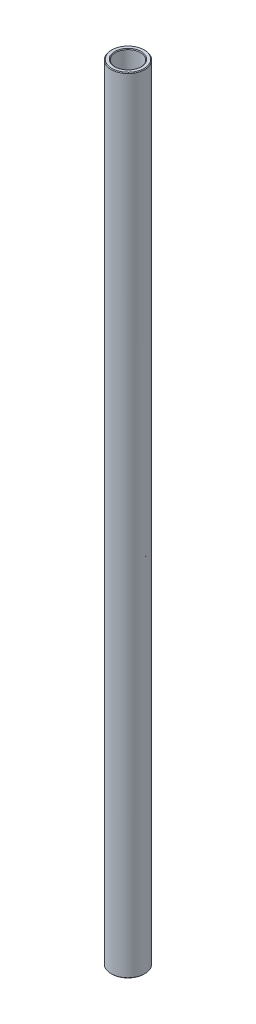
ISO-10303-21;
HEADER;
FILE_DESCRIPTION(('STEP AP214'),'2;1');
FILE_NAME('part.step','',(''),(''),'','','');
FILE_SCHEMA(('AUTOMOTIVE_DESIGN { 1 0 10303 214 1 1 1 1 }'));
ENDSEC;
DATA;
#1=APPLICATION_CONTEXT('core data for automotive mechanical design processes');
#2=APPLICATION_PROTOCOL_DEFINITION('international standard','automotive_design',2000,#1);
#3=PRODUCT_CONTEXT('',#1,'mechanical');
#4=PRODUCT('Part','Part','',(#3));
#5=PRODUCT_RELATED_PRODUCT_CATEGORY('part','',(#4));
#6=PRODUCT_DEFINITION_FORMATION('','',#4);
#7=PRODUCT_DEFINITION_CONTEXT('part definition',#1,'design');
#8=PRODUCT_DEFINITION('design','',#6,#7);
#9=PRODUCT_DEFINITION_SHAPE('','',#8);
#10=(LENGTH_UNIT() NAMED_UNIT(*) SI_UNIT(.MILLI.,.METRE.));
#11=(NAMED_UNIT(*) PLANE_ANGLE_UNIT() SI_UNIT($,.RADIAN.));
#12=(NAMED_UNIT(*) SI_UNIT($,.STERADIAN.) SOLID_ANGLE_UNIT());
#13=UNCERTAINTY_MEASURE_WITH_UNIT(LENGTH_MEASURE(1.E-05),#10,'distance_accuracy_value','');
#14=(GEOMETRIC_REPRESENTATION_CONTEXT(3) GLOBAL_UNCERTAINTY_ASSIGNED_CONTEXT((#13)) GLOBAL_UNIT_ASSIGNED_CONTEXT((#10,
#11,#12)) REPRESENTATION_CONTEXT('',''));
#15=CARTESIAN_POINT('',(0.,0.,0.));
#16=DIRECTION('',(0.,0.,1.));
#17=DIRECTION('',(1.,0.,0.));
#18=AXIS2_PLACEMENT_3D('',#15,#16,#17);
#19=CARTESIAN_POINT('',(0.,11.60859375,0.));
#20=DIRECTION('',(0.,1.,0.));
#21=DIRECTION('',(-1.,0.,0.));
#22=AXIS2_PLACEMENT_3D('',#19,#20,#21);
#23=CYLINDRICAL_SURFACE('',#22,4.7625);
#24=CARTESIAN_POINT('',(0.,-148.336,0.));
#25=DIRECTION('',(0.,1.,0.));
#26=DIRECTION('',(-1.,0.,0.));
#27=AXIS2_PLACEMENT_3D('',#24,#25,#26);
#28=CIRCLE('',#27,4.7625);
#29=CARTESIAN_POINT('',(-4.76250000000002,-148.336,0.));
#30=VERTEX_POINT('',#29);
#31=EDGE_CURVE('E57',#30,#30,#28,.F.);
#32=ORIENTED_EDGE('',*,*,#31,.T.);
#33=EDGE_LOOP('',(#32));
#34=FACE_BOUND('',#33,.T.);
#35=CARTESIAN_POINT('',(0.,148.336,0.));
#36=DIRECTION('',(0.,-1.,0.));
#37=DIRECTION('',(1.,0.,0.));
#38=AXIS2_PLACEMENT_3D('',#35,#36,#37);
#39=CIRCLE('',#38,4.7625);
#40=CARTESIAN_POINT('',(4.76250000000002,148.336,0.));
#41=VERTEX_POINT('',#40);
#42=EDGE_CURVE('E60',#41,#41,#39,.F.);
#43=ORIENTED_EDGE('',*,*,#42,.T.);
#44=EDGE_LOOP('',(#43));
#45=FACE_BOUND('',#44,.T.);
#46=ADVANCED_FACE('F37',(#34,#45),#23,.F.);
#47=CARTESIAN_POINT('',(4.76249999999998,148.59,0.));
#48=DIRECTION('',(0.,-1.,0.));
#49=DIRECTION('',(1.,0.,0.));
#50=AXIS2_PLACEMENT_3D('',#47,#48,#49);
#51=PLANE('',#50);
#52=CARTESIAN_POINT('',(0.,148.59,0.));
#53=DIRECTION('',(0.,-1.,0.));
#54=DIRECTION('',(1.,0.,0.));
#55=AXIS2_PLACEMENT_3D('',#52,#53,#54);
#56=CIRCLE('',#55,6.09599999999996);
#57=CARTESIAN_POINT('',(6.09599999999998,148.59,0.));
#58=VERTEX_POINT('',#57);
#59=EDGE_CURVE('E10',#58,#58,#56,.F.);
#60=ORIENTED_EDGE('',*,*,#59,.T.);
#61=EDGE_LOOP('',(#60));
#62=FACE_BOUND('',#61,.T.);
#63=CARTESIAN_POINT('',(0.,148.59,0.));
#64=DIRECTION('',(0.,-1.,0.));
#65=DIRECTION('',(1.,0.,0.));
#66=AXIS2_PLACEMENT_3D('',#63,#64,#65);
#67=CIRCLE('',#66,5.01650000000001);
#68=CARTESIAN_POINT('',(5.01650000000003,148.59,0.));
#69=VERTEX_POINT('',#68);
#70=EDGE_CURVE('E44',#69,#69,#67,.T.);
#71=ORIENTED_EDGE('',*,*,#70,.T.);
#72=EDGE_LOOP('',(#71));
#73=FACE_BOUND('',#72,.T.);
#74=ADVANCED_FACE('F83',(#62,#73),#51,.F.);
#75=CARTESIAN_POINT('',(0.,11.60859375,0.));
#76=DIRECTION('',(0.,1.,0.));
#77=DIRECTION('',(-1.,0.,0.));
#78=AXIS2_PLACEMENT_3D('',#75,#76,#77);
#79=CYLINDRICAL_SURFACE('',#78,6.35);
#80=CARTESIAN_POINT('',(0.,-148.336,0.));
#81=DIRECTION('',(0.,1.,0.));
#82=DIRECTION('',(-1.,0.,0.));
#83=AXIS2_PLACEMENT_3D('',#80,#81,#82);
#84=CIRCLE('',#83,6.35);
#85=CARTESIAN_POINT('',(-6.35000000000002,-148.336,0.));
#86=VERTEX_POINT('',#85);
#87=EDGE_CURVE('E48',#86,#86,#84,.T.);
#88=ORIENTED_EDGE('',*,*,#87,.T.);
#89=EDGE_LOOP('',(#88));
#90=FACE_BOUND('',#89,.T.);
#91=CARTESIAN_POINT('',(0.,148.336,0.));
#92=DIRECTION('',(0.,-1.,0.));
#93=DIRECTION('',(1.,0.,0.));
#94=AXIS2_PLACEMENT_3D('',#91,#92,#93);
#95=CIRCLE('',#94,6.35);
#96=CARTESIAN_POINT('',(6.35000000000002,148.336,0.));
#97=VERTEX_POINT('',#96);
#98=EDGE_CURVE('E52',#97,#97,#95,.T.);
#99=ORIENTED_EDGE('',*,*,#98,.T.);
#100=EDGE_LOOP('',(#99));
#101=FACE_BOUND('',#100,.T.);
#102=ADVANCED_FACE('F80',(#90,#101),#79,.T.);
#103=CARTESIAN_POINT('',(6.35000000000002,-148.59,0.));
#104=DIRECTION('',(0.,1.,0.));
#105=DIRECTION('',(-1.,0.,0.));
#106=AXIS2_PLACEMENT_3D('',#103,#104,#105);
#107=PLANE('',#106);
#108=CARTESIAN_POINT('',(0.,-148.59,0.));
#109=DIRECTION('',(0.,1.,0.));
#110=DIRECTION('',(-1.,0.,0.));
#111=AXIS2_PLACEMENT_3D('',#108,#109,#110);
#112=CIRCLE('',#111,5.01649999999992);
#113=CARTESIAN_POINT('',(-5.01649999999994,-148.59,0.));
#114=VERTEX_POINT('',#113);
#115=EDGE_CURVE('E63',#114,#114,#112,.T.);
#116=ORIENTED_EDGE('',*,*,#115,.T.);
#117=EDGE_LOOP('',(#116));
#118=FACE_BOUND('',#117,.T.);
#119=CARTESIAN_POINT('',(0.,-148.59,0.));
#120=DIRECTION('',(0.,1.,0.));
#121=DIRECTION('',(-1.,0.,0.));
#122=AXIS2_PLACEMENT_3D('',#119,#120,#121);
#123=CIRCLE('',#122,6.09599999999996);
#124=CARTESIAN_POINT('',(-6.09599999999998,-148.59,0.));
#125=VERTEX_POINT('',#124);
#126=EDGE_CURVE('E66',#125,#125,#123,.F.);
#127=ORIENTED_EDGE('',*,*,#126,.T.);
#128=EDGE_LOOP('',(#127));
#129=FACE_BOUND('',#128,.T.);
#130=ADVANCED_FACE('F70',(#118,#129),#107,.F.);
#131=CARTESIAN_POINT('',(0.,-148.59,0.));
#132=DIRECTION('',(0.,-1.,0.));
#133=DIRECTION('',(1.,0.,0.));
#134=AXIS2_PLACEMENT_3D('',#131,#132,#133);
#135=CONICAL_SURFACE('',#134,5.01649999999992,0.785398163397344);
#136=ORIENTED_EDGE('',*,*,#31,.F.);
#137=EDGE_LOOP('',(#136));
#138=FACE_BOUND('',#137,.T.);
#139=ORIENTED_EDGE('',*,*,#115,.F.);
#140=EDGE_LOOP('',(#139));
#141=FACE_BOUND('',#140,.T.);
#142=ADVANCED_FACE('F76',(#138,#141),#135,.F.);
#143=CARTESIAN_POINT('',(0.,-148.336,0.));
#144=DIRECTION('',(0.,1.,0.));
#145=DIRECTION('',(-1.,0.,0.));
#146=AXIS2_PLACEMENT_3D('',#143,#144,#145);
#147=CONICAL_SURFACE('',#146,6.35,0.78539816339746);
#148=ORIENTED_EDGE('',*,*,#126,.F.);
#149=EDGE_LOOP('',(#148));
#150=FACE_BOUND('',#149,.T.);
#151=ORIENTED_EDGE('',*,*,#87,.F.);
#152=EDGE_LOOP('',(#151));
#153=FACE_BOUND('',#152,.T.);
#154=ADVANCED_FACE('F72',(#150,#153),#147,.T.);
#155=CARTESIAN_POINT('',(0.,148.59,0.));
#156=DIRECTION('',(0.,-1.,0.));
#157=DIRECTION('',(1.,0.,0.));
#158=AXIS2_PLACEMENT_3D('',#155,#156,#157);
#159=CONICAL_SURFACE('',#158,6.09599999999996,0.78539816339746);
#160=ORIENTED_EDGE('',*,*,#98,.F.);
#161=EDGE_LOOP('',(#160));
#162=FACE_BOUND('',#161,.T.);
#163=ORIENTED_EDGE('',*,*,#59,.F.);
#164=EDGE_LOOP('',(#163));
#165=FACE_BOUND('',#164,.T.);
#166=ADVANCED_FACE('F75',(#162,#165),#159,.T.);
#167=CARTESIAN_POINT('',(0.,148.336,0.));
#168=DIRECTION('',(0.,1.,0.));
#169=DIRECTION('',(-1.,0.,0.));
#170=AXIS2_PLACEMENT_3D('',#167,#168,#169);
#171=CONICAL_SURFACE('',#170,4.7625,0.785398163397453);
#172=ORIENTED_EDGE('',*,*,#70,.F.);
#173=EDGE_LOOP('',(#172));
#174=FACE_BOUND('',#173,.T.);
#175=ORIENTED_EDGE('',*,*,#42,.F.);
#176=EDGE_LOOP('',(#175));
#177=FACE_BOUND('',#176,.T.);
#178=ADVANCED_FACE('F39',(#174,#177),#171,.F.);
#179=CLOSED_SHELL('',(#46,#74,#102,#130,#142,#154,#166,#178));
#180=MANIFOLD_SOLID_BREP('B2',#179);
#181=ADVANCED_BREP_SHAPE_REPRESENTATION('',(#18,#180),#14);
#182=SHAPE_DEFINITION_REPRESENTATION(#9,#181);
ENDSEC;
END-ISO-10303-21;
